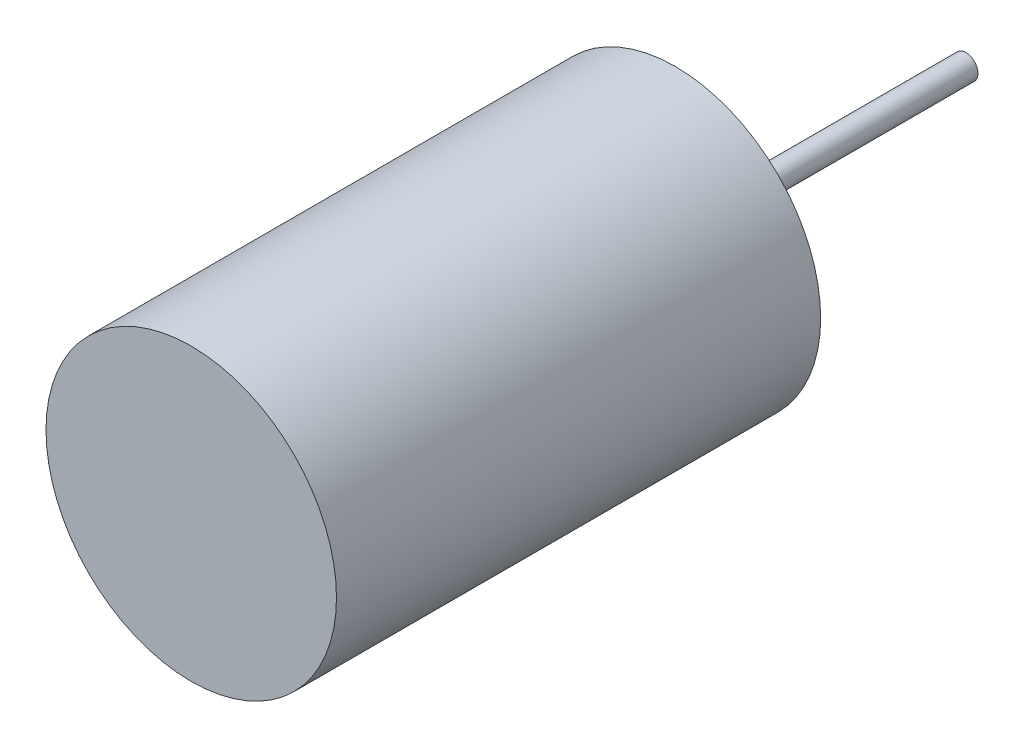
ISO-10303-21;
HEADER;
FILE_DESCRIPTION(('STEP AP214'),'2;1');
FILE_NAME('part.step','',(''),(''),'','','');
FILE_SCHEMA(('AUTOMOTIVE_DESIGN { 1 0 10303 214 1 1 1 1 }'));
ENDSEC;
DATA;
#1=APPLICATION_CONTEXT('core data for automotive mechanical design processes');
#2=APPLICATION_PROTOCOL_DEFINITION('international standard','automotive_design',2000,#1);
#3=PRODUCT_CONTEXT('',#1,'mechanical');
#4=PRODUCT('Part','Part','',(#3));
#5=PRODUCT_RELATED_PRODUCT_CATEGORY('part','',(#4));
#6=PRODUCT_DEFINITION_FORMATION('','',#4);
#7=PRODUCT_DEFINITION_CONTEXT('part definition',#1,'design');
#8=PRODUCT_DEFINITION('design','',#6,#7);
#9=PRODUCT_DEFINITION_SHAPE('','',#8);
#10=(LENGTH_UNIT() NAMED_UNIT(*) SI_UNIT(.MILLI.,.METRE.));
#11=(NAMED_UNIT(*) PLANE_ANGLE_UNIT() SI_UNIT($,.RADIAN.));
#12=(NAMED_UNIT(*) SI_UNIT($,.STERADIAN.) SOLID_ANGLE_UNIT());
#13=UNCERTAINTY_MEASURE_WITH_UNIT(LENGTH_MEASURE(1.E-05),#10,'distance_accuracy_value','');
#14=(GEOMETRIC_REPRESENTATION_CONTEXT(3) GLOBAL_UNCERTAINTY_ASSIGNED_CONTEXT((#13)) GLOBAL_UNIT_ASSIGNED_CONTEXT((#10,
#11,#12)) REPRESENTATION_CONTEXT('',''));
#15=CARTESIAN_POINT('',(0.,0.,0.));
#16=DIRECTION('',(0.,0.,1.));
#17=DIRECTION('',(1.,0.,0.));
#18=AXIS2_PLACEMENT_3D('',#15,#16,#17);
#19=CARTESIAN_POINT('',(0.,0.,10.));
#20=DIRECTION('',(0.,0.,-1.));
#21=DIRECTION('',(-1.,0.,0.));
#22=AXIS2_PLACEMENT_3D('',#19,#20,#21);
#23=CYLINDRICAL_SURFACE('',#22,3.);
#24=CARTESIAN_POINT('',(0.,0.,10.));
#25=DIRECTION('',(0.,0.,1.));
#26=DIRECTION('',(1.,0.,0.));
#27=AXIS2_PLACEMENT_3D('',#24,#25,#26);
#28=CIRCLE('',#27,3.);
#29=CARTESIAN_POINT('',(3.,0.,10.));
#30=VERTEX_POINT('',#29);
#31=EDGE_CURVE('E44',#30,#30,#28,.T.);
#32=ORIENTED_EDGE('',*,*,#31,.F.);
#33=EDGE_LOOP('',(#32));
#34=FACE_BOUND('',#33,.T.);
#35=CARTESIAN_POINT('',(0.,0.,0.));
#36=DIRECTION('',(0.,0.,1.));
#37=DIRECTION('',(1.,0.,0.));
#38=AXIS2_PLACEMENT_3D('',#35,#36,#37);
#39=CIRCLE('',#38,3.);
#40=CARTESIAN_POINT('',(3.,0.,0.));
#41=VERTEX_POINT('',#40);
#42=EDGE_CURVE('E49',#41,#41,#39,.T.);
#43=ORIENTED_EDGE('',*,*,#42,.T.);
#44=EDGE_LOOP('',(#43));
#45=FACE_BOUND('',#44,.T.);
#46=ADVANCED_FACE('F37',(#34,#45),#23,.T.);
#47=CARTESIAN_POINT('',(0.,0.,10.));
#48=DIRECTION('',(0.,0.,1.));
#49=DIRECTION('',(1.,0.,0.));
#50=AXIS2_PLACEMENT_3D('',#47,#48,#49);
#51=PLANE('',#50);
#52=ORIENTED_EDGE('',*,*,#31,.T.);
#53=EDGE_LOOP('',(#52));
#54=FACE_BOUND('',#53,.T.);
#55=ADVANCED_FACE('F72',(#54),#51,.T.);
#56=CARTESIAN_POINT('',(0.,0.,0.));
#57=DIRECTION('',(0.,0.,1.));
#58=DIRECTION('',(1.,0.,0.));
#59=AXIS2_PLACEMENT_3D('',#56,#57,#58);
#60=PLANE('',#59);
#61=CARTESIAN_POINT('',(0.,0.,0.));
#62=DIRECTION('',(0.,0.,1.));
#63=DIRECTION('',(1.,0.,0.));
#64=AXIS2_PLACEMENT_3D('',#61,#62,#63);
#65=CIRCLE('',#64,0.25);
#66=CARTESIAN_POINT('',(0.25,0.,0.));
#67=VERTEX_POINT('',#66);
#68=EDGE_CURVE('E10',#67,#67,#65,.F.);
#69=ORIENTED_EDGE('',*,*,#68,.F.);
#70=EDGE_LOOP('',(#69));
#71=FACE_BOUND('',#70,.T.);
#72=ORIENTED_EDGE('',*,*,#42,.F.);
#73=EDGE_LOOP('',(#72));
#74=FACE_BOUND('',#73,.T.);
#75=ADVANCED_FACE('F65',(#71,#74),#60,.F.);
#76=CARTESIAN_POINT('',(0.,0.,-6.));
#77=DIRECTION('',(0.,0.,1.));
#78=DIRECTION('',(1.,0.,0.));
#79=AXIS2_PLACEMENT_3D('',#76,#77,#78);
#80=CYLINDRICAL_SURFACE('',#79,0.25);
#81=CARTESIAN_POINT('',(0.,0.,-6.));
#82=DIRECTION('',(0.,0.,-1.));
#83=DIRECTION('',(-1.,0.,0.));
#84=AXIS2_PLACEMENT_3D('',#81,#82,#83);
#85=CIRCLE('',#84,0.25);
#86=CARTESIAN_POINT('',(-0.25,0.,-6.));
#87=VERTEX_POINT('',#86);
#88=EDGE_CURVE('E55',#87,#87,#85,.T.);
#89=ORIENTED_EDGE('',*,*,#88,.F.);
#90=EDGE_LOOP('',(#89));
#91=FACE_BOUND('',#90,.T.);
#92=ORIENTED_EDGE('',*,*,#68,.T.);
#93=EDGE_LOOP('',(#92));
#94=FACE_BOUND('',#93,.T.);
#95=ADVANCED_FACE('F63',(#91,#94),#80,.T.);
#96=CARTESIAN_POINT('',(0.,0.,-6.));
#97=DIRECTION('',(0.,0.,-1.));
#98=DIRECTION('',(-1.,0.,0.));
#99=AXIS2_PLACEMENT_3D('',#96,#97,#98);
#100=PLANE('',#99);
#101=ORIENTED_EDGE('',*,*,#88,.T.);
#102=EDGE_LOOP('',(#101));
#103=FACE_BOUND('',#102,.T.);
#104=ADVANCED_FACE('F61',(#103),#100,.T.);
#105=CLOSED_SHELL('',(#46,#55,#75,#95,#104));
#106=MANIFOLD_SOLID_BREP('B2',#105);
#107=ADVANCED_BREP_SHAPE_REPRESENTATION('',(#18,#106),#14);
#108=SHAPE_DEFINITION_REPRESENTATION(#9,#107);
ENDSEC;
END-ISO-10303-21;
